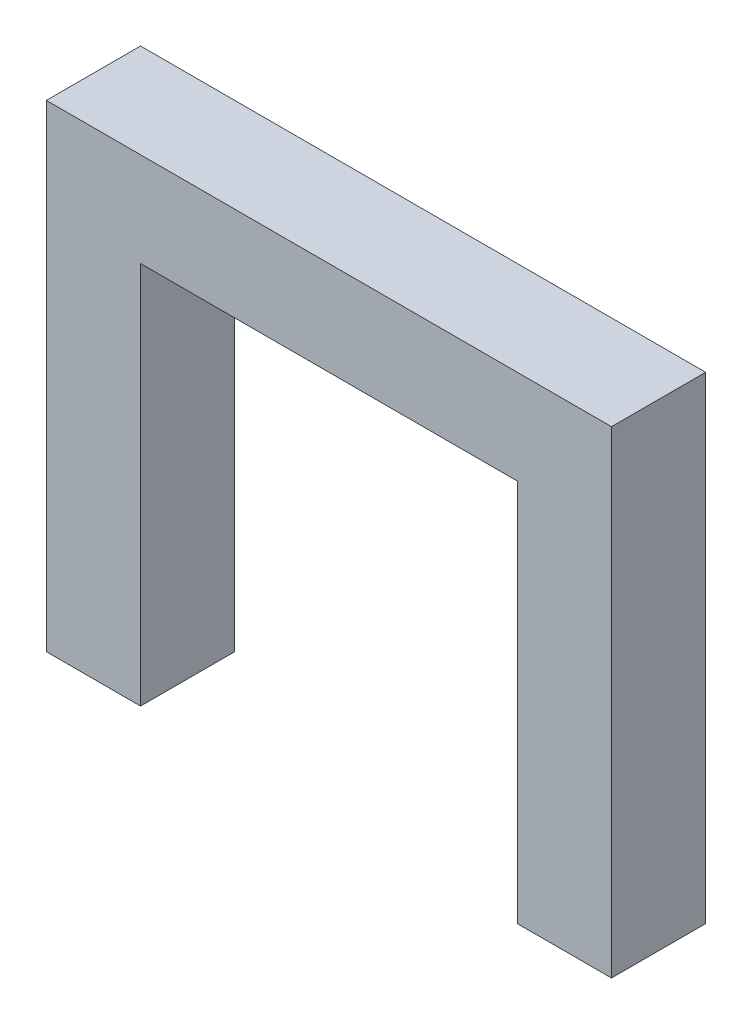
ISO-10303-21;
HEADER;
FILE_DESCRIPTION(('STEP AP214'),'2;1');
FILE_NAME('part.step','',(''),(''),'','','');
FILE_SCHEMA(('AUTOMOTIVE_DESIGN { 1 0 10303 214 1 1 1 1 }'));
ENDSEC;
DATA;
#1=APPLICATION_CONTEXT('core data for automotive mechanical design processes');
#2=APPLICATION_PROTOCOL_DEFINITION('international standard','automotive_design',2000,#1);
#3=PRODUCT_CONTEXT('',#1,'mechanical');
#4=PRODUCT('Part','Part','',(#3));
#5=PRODUCT_RELATED_PRODUCT_CATEGORY('part','',(#4));
#6=PRODUCT_DEFINITION_FORMATION('','',#4);
#7=PRODUCT_DEFINITION_CONTEXT('part definition',#1,'design');
#8=PRODUCT_DEFINITION('design','',#6,#7);
#9=PRODUCT_DEFINITION_SHAPE('','',#8);
#10=(LENGTH_UNIT() NAMED_UNIT(*) SI_UNIT(.MILLI.,.METRE.));
#11=(NAMED_UNIT(*) PLANE_ANGLE_UNIT() SI_UNIT($,.RADIAN.));
#12=(NAMED_UNIT(*) SI_UNIT($,.STERADIAN.) SOLID_ANGLE_UNIT());
#13=UNCERTAINTY_MEASURE_WITH_UNIT(LENGTH_MEASURE(1.E-05),#10,'distance_accuracy_value','');
#14=(GEOMETRIC_REPRESENTATION_CONTEXT(3) GLOBAL_UNCERTAINTY_ASSIGNED_CONTEXT((#13)) GLOBAL_UNIT_ASSIGNED_CONTEXT((#10,
#11,#12)) REPRESENTATION_CONTEXT('',''));
#15=CARTESIAN_POINT('',(0.,0.,0.));
#16=DIRECTION('',(0.,0.,1.));
#17=DIRECTION('',(1.,0.,0.));
#18=AXIS2_PLACEMENT_3D('',#15,#16,#17);
#19=CARTESIAN_POINT('',(-8.45188284518833,0.,20.));
#20=DIRECTION('',(1.,0.,0.));
#21=DIRECTION('',(0.,1.,0.));
#22=AXIS2_PLACEMENT_3D('',#19,#20,#21);
#23=PLANE('',#22);
#24=DIRECTION('',(0.,-1.,0.));
#25=VECTOR('',#24,1.);
#26=CARTESIAN_POINT('',(-8.45188284518833,0.,0.));
#27=LINE('',#26,#25);
#28=CARTESIAN_POINT('',(-8.45188284518833,28.6192468619247,0.));
#29=VERTEX_POINT('',#28);
#30=CARTESIAN_POINT('',(-8.45188284518832,-52.7607531380753,0.));
#31=VERTEX_POINT('',#30);
#32=EDGE_CURVE('E128',#29,#31,#27,.T.);
#33=ORIENTED_EDGE('',*,*,#32,.F.);
#34=DIRECTION('',(0.,0.,-1.));
#35=VECTOR('',#34,1.);
#36=CARTESIAN_POINT('',(-8.45188284518833,28.6192468619247,20.));
#37=LINE('',#36,#35);
#38=CARTESIAN_POINT('',(-8.45188284518833,28.6192468619247,20.));
#39=VERTEX_POINT('',#38);
#40=EDGE_CURVE('E11',#39,#29,#37,.T.);
#41=ORIENTED_EDGE('',*,*,#40,.F.);
#42=DIRECTION('',(0.,-1.,0.));
#43=VECTOR('',#42,1.);
#44=CARTESIAN_POINT('',(-8.45188284518833,0.,20.));
#45=LINE('',#44,#43);
#46=CARTESIAN_POINT('',(-8.45188284518832,-52.7607531380753,20.));
#47=VERTEX_POINT('',#46);
#48=EDGE_CURVE('E148',#39,#47,#45,.T.);
#49=ORIENTED_EDGE('',*,*,#48,.T.);
#50=DIRECTION('',(0.,0.,-1.));
#51=VECTOR('',#50,1.);
#52=CARTESIAN_POINT('',(-8.45188284518832,-52.7607531380753,20.));
#53=LINE('',#52,#51);
#54=EDGE_CURVE('E51',#47,#31,#53,.T.);
#55=ORIENTED_EDGE('',*,*,#54,.T.);
#56=EDGE_LOOP('',(#33,#41,#49,#55));
#57=FACE_BOUND('',#56,.T.);
#58=ADVANCED_FACE('F35',(#57),#23,.T.);
#59=CARTESIAN_POINT('',(0.,28.6192468619247,20.));
#60=DIRECTION('',(0.,-1.,0.));
#61=DIRECTION('',(1.,0.,0.));
#62=AXIS2_PLACEMENT_3D('',#59,#60,#61);
#63=PLANE('',#62);
#64=DIRECTION('',(-1.,0.,0.));
#65=VECTOR('',#64,1.);
#66=CARTESIAN_POINT('',(0.,28.6192468619247,0.));
#67=LINE('',#66,#65);
#68=CARTESIAN_POINT('',(71.5481171548117,28.6192468619247,0.));
#69=VERTEX_POINT('',#68);
#70=EDGE_CURVE('E130',#69,#29,#67,.T.);
#71=ORIENTED_EDGE('',*,*,#70,.F.);
#72=DIRECTION('',(0.,0.,-1.));
#73=VECTOR('',#72,1.);
#74=CARTESIAN_POINT('',(71.5481171548117,28.6192468619247,20.));
#75=LINE('',#74,#73);
#76=CARTESIAN_POINT('',(71.5481171548117,28.6192468619247,20.));
#77=VERTEX_POINT('',#76);
#78=EDGE_CURVE('E43',#77,#69,#75,.T.);
#79=ORIENTED_EDGE('',*,*,#78,.F.);
#80=DIRECTION('',(-1.,0.,0.));
#81=VECTOR('',#80,1.);
#82=CARTESIAN_POINT('',(0.,28.6192468619247,20.));
#83=LINE('',#82,#81);
#84=EDGE_CURVE('E174',#77,#39,#83,.T.);
#85=ORIENTED_EDGE('',*,*,#84,.T.);
#86=ORIENTED_EDGE('',*,*,#40,.T.);
#87=EDGE_LOOP('',(#71,#79,#85,#86));
#88=FACE_BOUND('',#87,.T.);
#89=ADVANCED_FACE('F165',(#88),#63,.T.);
#90=CARTESIAN_POINT('',(71.5481171548117,0.,20.));
#91=DIRECTION('',(-1.,0.,0.));
#92=DIRECTION('',(0.,-1.,0.));
#93=AXIS2_PLACEMENT_3D('',#90,#91,#92);
#94=PLANE('',#93);
#95=DIRECTION('',(0.,1.,0.));
#96=VECTOR('',#95,1.);
#97=CARTESIAN_POINT('',(71.5481171548117,0.,0.));
#98=LINE('',#97,#96);
#99=CARTESIAN_POINT('',(71.5481171548117,-52.7607531380753,0.));
#100=VERTEX_POINT('',#99);
#101=EDGE_CURVE('E133',#100,#69,#98,.T.);
#102=ORIENTED_EDGE('',*,*,#101,.F.);
#103=DIRECTION('',(0.,0.,-1.));
#104=VECTOR('',#103,1.);
#105=CARTESIAN_POINT('',(71.5481171548117,-52.7607531380753,20.));
#106=LINE('',#105,#104);
#107=CARTESIAN_POINT('',(71.5481171548117,-52.7607531380753,20.));
#108=VERTEX_POINT('',#107);
#109=EDGE_CURVE('E154',#108,#100,#106,.T.);
#110=ORIENTED_EDGE('',*,*,#109,.F.);
#111=DIRECTION('',(0.,1.,0.));
#112=VECTOR('',#111,1.);
#113=CARTESIAN_POINT('',(71.5481171548117,0.,20.));
#114=LINE('',#113,#112);
#115=EDGE_CURVE('E161',#108,#77,#114,.T.);
#116=ORIENTED_EDGE('',*,*,#115,.T.);
#117=ORIENTED_EDGE('',*,*,#78,.T.);
#118=EDGE_LOOP('',(#102,#110,#116,#117));
#119=FACE_BOUND('',#118,.T.);
#120=ADVANCED_FACE('F159',(#119),#94,.T.);
#121=CARTESIAN_POINT('',(0.,-52.7607531380753,20.));
#122=DIRECTION('',(0.,-1.,0.));
#123=DIRECTION('',(0.,0.,-1.));
#124=AXIS2_PLACEMENT_3D('',#121,#122,#123);
#125=PLANE('',#124);
#126=DIRECTION('',(-1.,0.,0.));
#127=VECTOR('',#126,1.);
#128=CARTESIAN_POINT('',(0.,-52.7607531380753,0.));
#129=LINE('',#128,#127);
#130=CARTESIAN_POINT('',(91.5481171548117,-52.7607531380753,0.));
#131=VERTEX_POINT('',#130);
#132=EDGE_CURVE('E136',#131,#100,#129,.T.);
#133=ORIENTED_EDGE('',*,*,#132,.F.);
#134=DIRECTION('',(0.,0.,-1.));
#135=VECTOR('',#134,1.);
#136=CARTESIAN_POINT('',(91.5481171548117,-52.7607531380753,20.));
#137=LINE('',#136,#135);
#138=CARTESIAN_POINT('',(91.5481171548117,-52.7607531380753,20.));
#139=VERTEX_POINT('',#138);
#140=EDGE_CURVE('E152',#139,#131,#137,.T.);
#141=ORIENTED_EDGE('',*,*,#140,.F.);
#142=DIRECTION('',(-1.,0.,0.));
#143=VECTOR('',#142,1.);
#144=CARTESIAN_POINT('',(0.,-52.7607531380753,20.));
#145=LINE('',#144,#143);
#146=EDGE_CURVE('E173',#139,#108,#145,.T.);
#147=ORIENTED_EDGE('',*,*,#146,.T.);
#148=ORIENTED_EDGE('',*,*,#109,.T.);
#149=EDGE_LOOP('',(#133,#141,#147,#148));
#150=FACE_BOUND('',#149,.T.);
#151=ADVANCED_FACE('F171',(#150),#125,.T.);
#152=CARTESIAN_POINT('',(91.5481171548117,0.,20.));
#153=DIRECTION('',(1.,0.,0.));
#154=DIRECTION('',(0.,1.,0.));
#155=AXIS2_PLACEMENT_3D('',#152,#153,#154);
#156=PLANE('',#155);
#157=DIRECTION('',(0.,-1.,0.));
#158=VECTOR('',#157,1.);
#159=CARTESIAN_POINT('',(91.5481171548117,0.,0.));
#160=LINE('',#159,#158);
#161=CARTESIAN_POINT('',(91.5481171548117,48.6192468619247,0.));
#162=VERTEX_POINT('',#161);
#163=EDGE_CURVE('E139',#162,#131,#160,.T.);
#164=ORIENTED_EDGE('',*,*,#163,.F.);
#165=DIRECTION('',(0.,0.,-1.));
#166=VECTOR('',#165,1.);
#167=CARTESIAN_POINT('',(91.5481171548117,48.6192468619247,20.));
#168=LINE('',#167,#166);
#169=CARTESIAN_POINT('',(91.5481171548117,48.6192468619247,20.));
#170=VERTEX_POINT('',#169);
#171=EDGE_CURVE('E110',#170,#162,#168,.T.);
#172=ORIENTED_EDGE('',*,*,#171,.F.);
#173=DIRECTION('',(0.,-1.,0.));
#174=VECTOR('',#173,1.);
#175=CARTESIAN_POINT('',(91.5481171548117,0.,20.));
#176=LINE('',#175,#174);
#177=EDGE_CURVE('E120',#170,#139,#176,.T.);
#178=ORIENTED_EDGE('',*,*,#177,.T.);
#179=ORIENTED_EDGE('',*,*,#140,.T.);
#180=EDGE_LOOP('',(#164,#172,#178,#179));
#181=FACE_BOUND('',#180,.T.);
#182=ADVANCED_FACE('F180',(#181),#156,.T.);
#183=CARTESIAN_POINT('',(0.,48.6192468619247,20.));
#184=DIRECTION('',(0.,1.,0.));
#185=DIRECTION('',(0.,0.,1.));
#186=AXIS2_PLACEMENT_3D('',#183,#184,#185);
#187=PLANE('',#186);
#188=DIRECTION('',(1.,0.,0.));
#189=VECTOR('',#188,1.);
#190=CARTESIAN_POINT('',(0.,48.6192468619247,0.));
#191=LINE('',#190,#189);
#192=CARTESIAN_POINT('',(-28.4518828451883,48.6192468619247,0.));
#193=VERTEX_POINT('',#192);
#194=EDGE_CURVE('E106',#193,#162,#191,.T.);
#195=ORIENTED_EDGE('',*,*,#194,.F.);
#196=DIRECTION('',(0.,0.,-1.));
#197=VECTOR('',#196,1.);
#198=CARTESIAN_POINT('',(-28.4518828451883,48.6192468619247,20.));
#199=LINE('',#198,#197);
#200=CARTESIAN_POINT('',(-28.4518828451883,48.6192468619247,20.));
#201=VERTEX_POINT('',#200);
#202=EDGE_CURVE('E101',#201,#193,#199,.T.);
#203=ORIENTED_EDGE('',*,*,#202,.F.);
#204=DIRECTION('',(1.,0.,0.));
#205=VECTOR('',#204,1.);
#206=CARTESIAN_POINT('',(0.,48.6192468619247,20.));
#207=LINE('',#206,#205);
#208=EDGE_CURVE('E104',#201,#170,#207,.T.);
#209=ORIENTED_EDGE('',*,*,#208,.T.);
#210=ORIENTED_EDGE('',*,*,#171,.T.);
#211=EDGE_LOOP('',(#195,#203,#209,#210));
#212=FACE_BOUND('',#211,.T.);
#213=ADVANCED_FACE('F103',(#212),#187,.T.);
#214=CARTESIAN_POINT('',(-28.4518828451883,0.,20.));
#215=DIRECTION('',(-1.,0.,0.));
#216=DIRECTION('',(0.,0.,1.));
#217=AXIS2_PLACEMENT_3D('',#214,#215,#216);
#218=PLANE('',#217);
#219=DIRECTION('',(0.,1.,0.));
#220=VECTOR('',#219,1.);
#221=CARTESIAN_POINT('',(-28.4518828451883,0.,0.));
#222=LINE('',#221,#220);
#223=CARTESIAN_POINT('',(-28.4518828451883,-52.7607531380753,0.));
#224=VERTEX_POINT('',#223);
#225=EDGE_CURVE('E143',#224,#193,#222,.T.);
#226=ORIENTED_EDGE('',*,*,#225,.F.);
#227=DIRECTION('',(0.,0.,-1.));
#228=VECTOR('',#227,1.);
#229=CARTESIAN_POINT('',(-28.4518828451883,-52.7607531380753,20.));
#230=LINE('',#229,#228);
#231=CARTESIAN_POINT('',(-28.4518828451883,-52.7607531380753,20.));
#232=VERTEX_POINT('',#231);
#233=EDGE_CURVE('E76',#232,#224,#230,.T.);
#234=ORIENTED_EDGE('',*,*,#233,.F.);
#235=DIRECTION('',(0.,1.,0.));
#236=VECTOR('',#235,1.);
#237=CARTESIAN_POINT('',(-28.4518828451883,0.,20.));
#238=LINE('',#237,#236);
#239=EDGE_CURVE('E117',#232,#201,#238,.T.);
#240=ORIENTED_EDGE('',*,*,#239,.T.);
#241=ORIENTED_EDGE('',*,*,#202,.T.);
#242=EDGE_LOOP('',(#226,#234,#240,#241));
#243=FACE_BOUND('',#242,.T.);
#244=ADVANCED_FACE('F122',(#243),#218,.T.);
#245=CARTESIAN_POINT('',(0.,-52.7607531380753,20.));
#246=DIRECTION('',(0.,-1.,0.));
#247=DIRECTION('',(0.,0.,-1.));
#248=AXIS2_PLACEMENT_3D('',#245,#246,#247);
#249=PLANE('',#248);
#250=DIRECTION('',(-1.,0.,0.));
#251=VECTOR('',#250,1.);
#252=CARTESIAN_POINT('',(0.,-52.7607531380753,0.));
#253=LINE('',#252,#251);
#254=EDGE_CURVE('E145',#31,#224,#253,.T.);
#255=ORIENTED_EDGE('',*,*,#254,.F.);
#256=ORIENTED_EDGE('',*,*,#54,.F.);
#257=DIRECTION('',(-1.,0.,0.));
#258=VECTOR('',#257,1.);
#259=CARTESIAN_POINT('',(0.,-52.7607531380753,20.));
#260=LINE('',#259,#258);
#261=EDGE_CURVE('E123',#47,#232,#260,.T.);
#262=ORIENTED_EDGE('',*,*,#261,.T.);
#263=ORIENTED_EDGE('',*,*,#233,.T.);
#264=EDGE_LOOP('',(#255,#256,#262,#263));
#265=FACE_BOUND('',#264,.T.);
#266=ADVANCED_FACE('F181',(#265),#249,.T.);
#267=CARTESIAN_POINT('',(0.,0.,20.));
#268=DIRECTION('',(0.,0.,1.));
#269=DIRECTION('',(1.,0.,0.));
#270=AXIS2_PLACEMENT_3D('',#267,#268,#269);
#271=PLANE('',#270);
#272=ORIENTED_EDGE('',*,*,#48,.F.);
#273=ORIENTED_EDGE('',*,*,#84,.F.);
#274=ORIENTED_EDGE('',*,*,#115,.F.);
#275=ORIENTED_EDGE('',*,*,#146,.F.);
#276=ORIENTED_EDGE('',*,*,#177,.F.);
#277=ORIENTED_EDGE('',*,*,#208,.F.);
#278=ORIENTED_EDGE('',*,*,#239,.F.);
#279=ORIENTED_EDGE('',*,*,#261,.F.);
#280=EDGE_LOOP('',(#272,#273,#274,#275,#276,#277,#278,#279));
#281=FACE_BOUND('',#280,.T.);
#282=ADVANCED_FACE('F115',(#281),#271,.T.);
#283=CARTESIAN_POINT('',(0.,0.,0.));
#284=DIRECTION('',(0.,0.,1.));
#285=DIRECTION('',(1.,0.,0.));
#286=AXIS2_PLACEMENT_3D('',#283,#284,#285);
#287=PLANE('',#286);
#288=ORIENTED_EDGE('',*,*,#32,.T.);
#289=ORIENTED_EDGE('',*,*,#254,.T.);
#290=ORIENTED_EDGE('',*,*,#225,.T.);
#291=ORIENTED_EDGE('',*,*,#194,.T.);
#292=ORIENTED_EDGE('',*,*,#163,.T.);
#293=ORIENTED_EDGE('',*,*,#132,.T.);
#294=ORIENTED_EDGE('',*,*,#101,.T.);
#295=ORIENTED_EDGE('',*,*,#70,.T.);
#296=EDGE_LOOP('',(#288,#289,#290,#291,#292,#293,#294,#295));
#297=FACE_BOUND('',#296,.T.);
#298=ADVANCED_FACE('F167',(#297),#287,.F.);
#299=CLOSED_SHELL('',(#58,#89,#120,#151,#182,#213,#244,#266,#282,#298));
#300=MANIFOLD_SOLID_BREP('B2',#299);
#301=ADVANCED_BREP_SHAPE_REPRESENTATION('',(#18,#300),#14);
#302=SHAPE_DEFINITION_REPRESENTATION(#9,#301);
ENDSEC;
END-ISO-10303-21;
